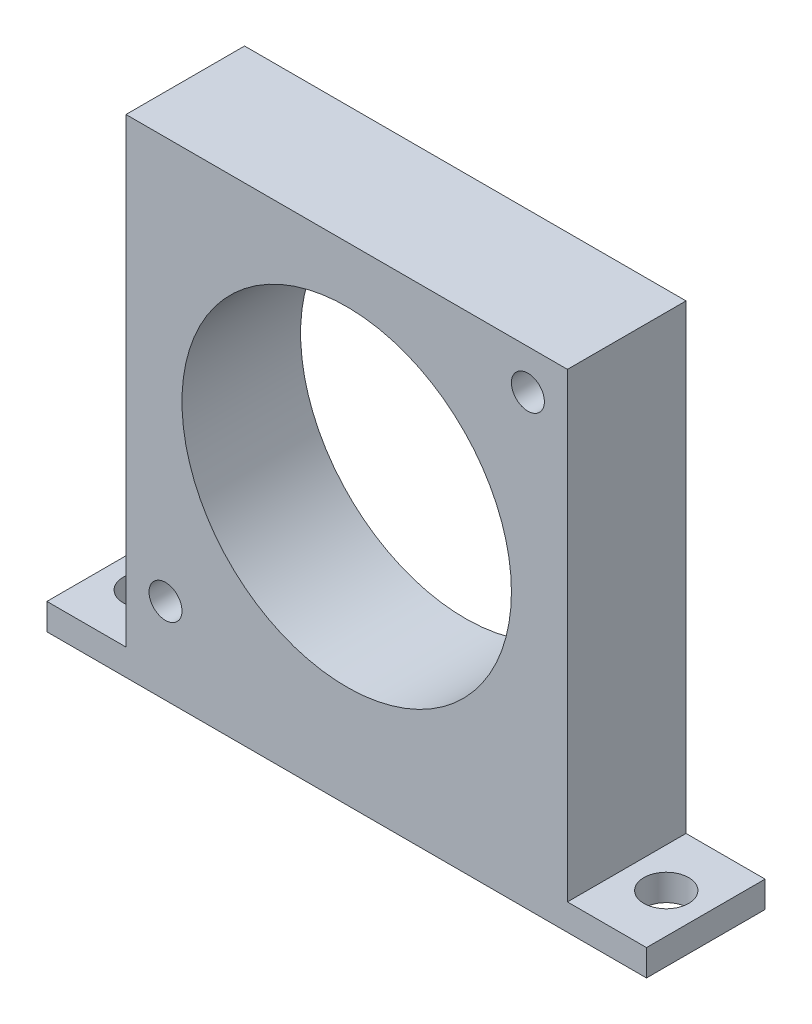
ISO-10303-21;
HEADER;
FILE_DESCRIPTION(('STEP AP214'),'2;1');
FILE_NAME('part.step','',(''),(''),'','','');
FILE_SCHEMA(('AUTOMOTIVE_DESIGN { 1 0 10303 214 1 1 1 1 }'));
ENDSEC;
DATA;
#1=APPLICATION_CONTEXT('core data for automotive mechanical design processes');
#2=APPLICATION_PROTOCOL_DEFINITION('international standard','automotive_design',2000,#1);
#3=PRODUCT_CONTEXT('',#1,'mechanical');
#4=PRODUCT('Part','Part','',(#3));
#5=PRODUCT_RELATED_PRODUCT_CATEGORY('part','',(#4));
#6=PRODUCT_DEFINITION_FORMATION('','',#4);
#7=PRODUCT_DEFINITION_CONTEXT('part definition',#1,'design');
#8=PRODUCT_DEFINITION('design','',#6,#7);
#9=PRODUCT_DEFINITION_SHAPE('','',#8);
#10=(LENGTH_UNIT() NAMED_UNIT(*) SI_UNIT(.MILLI.,.METRE.));
#11=(NAMED_UNIT(*) PLANE_ANGLE_UNIT() SI_UNIT($,.RADIAN.));
#12=(NAMED_UNIT(*) SI_UNIT($,.STERADIAN.) SOLID_ANGLE_UNIT());
#13=UNCERTAINTY_MEASURE_WITH_UNIT(LENGTH_MEASURE(1.E-05),#10,'distance_accuracy_value','');
#14=(GEOMETRIC_REPRESENTATION_CONTEXT(3) GLOBAL_UNCERTAINTY_ASSIGNED_CONTEXT((#13)) GLOBAL_UNIT_ASSIGNED_CONTEXT((#10,
#11,#12)) REPRESENTATION_CONTEXT('',''));
#15=CARTESIAN_POINT('',(0.,0.,0.));
#16=DIRECTION('',(0.,0.,1.));
#17=DIRECTION('',(1.,0.,0.));
#18=AXIS2_PLACEMENT_3D('',#15,#16,#17);
#19=CARTESIAN_POINT('',(0.,2.,9.));
#20=DIRECTION('',(0.,1.,0.));
#21=DIRECTION('',(0.,0.,1.));
#22=AXIS2_PLACEMENT_3D('',#19,#20,#21);
#23=PLANE('',#22);
#24=CARTESIAN_POINT('',(2.99999999999999,2.,4.5));
#25=DIRECTION('',(0.,1.,0.));
#26=DIRECTION('',(0.,0.,1.));
#27=AXIS2_PLACEMENT_3D('',#24,#25,#26);
#28=CIRCLE('',#27,1.7);
#29=CARTESIAN_POINT('',(2.99999999999999,2.,6.2));
#30=VERTEX_POINT('',#29);
#31=EDGE_CURVE('E249',#30,#30,#28,.T.);
#32=ORIENTED_EDGE('',*,*,#31,.F.);
#33=EDGE_LOOP('',(#32));
#34=FACE_BOUND('',#33,.T.);
#35=DIRECTION('',(1.,0.,0.));
#36=VECTOR('',#35,1.);
#37=CARTESIAN_POINT('',(0.,2.,0.));
#38=LINE('',#37,#36);
#39=CARTESIAN_POINT('',(0.,2.,0.));
#40=VERTEX_POINT('',#39);
#41=CARTESIAN_POINT('',(5.99999999999999,2.,0.));
#42=VERTEX_POINT('',#41);
#43=EDGE_CURVE('E141',#40,#42,#38,.T.);
#44=ORIENTED_EDGE('',*,*,#43,.F.);
#45=DIRECTION('',(0.,0.,-1.));
#46=VECTOR('',#45,1.);
#47=CARTESIAN_POINT('',(0.,2.,9.));
#48=LINE('',#47,#46);
#49=CARTESIAN_POINT('',(0.,2.,9.));
#50=VERTEX_POINT('',#49);
#51=EDGE_CURVE('E13',#50,#40,#48,.T.);
#52=ORIENTED_EDGE('',*,*,#51,.F.);
#53=DIRECTION('',(1.,0.,0.));
#54=VECTOR('',#53,1.);
#55=CARTESIAN_POINT('',(0.,2.,9.));
#56=LINE('',#55,#54);
#57=CARTESIAN_POINT('',(5.99999999999999,2.,9.));
#58=VERTEX_POINT('',#57);
#59=EDGE_CURVE('E161',#50,#58,#56,.T.);
#60=ORIENTED_EDGE('',*,*,#59,.T.);
#61=DIRECTION('',(0.,0.,-1.));
#62=VECTOR('',#61,1.);
#63=CARTESIAN_POINT('',(5.99999999999999,2.,9.));
#64=LINE('',#63,#62);
#65=EDGE_CURVE('E47',#58,#42,#64,.T.);
#66=ORIENTED_EDGE('',*,*,#65,.T.);
#67=EDGE_LOOP('',(#44,#52,#60,#66));
#68=FACE_BOUND('',#67,.T.);
#69=ADVANCED_FACE('F44',(#34,#68),#23,.T.);
#70=CARTESIAN_POINT('',(0.,0.,9.));
#71=DIRECTION('',(-1.,0.,0.));
#72=DIRECTION('',(0.,-1.,0.));
#73=AXIS2_PLACEMENT_3D('',#70,#71,#72);
#74=PLANE('',#73);
#75=DIRECTION('',(0.,1.,0.));
#76=VECTOR('',#75,1.);
#77=CARTESIAN_POINT('',(0.,0.,0.));
#78=LINE('',#77,#76);
#79=CARTESIAN_POINT('',(0.,0.,0.));
#80=VERTEX_POINT('',#79);
#81=EDGE_CURVE('E159',#80,#40,#78,.T.);
#82=ORIENTED_EDGE('',*,*,#81,.F.);
#83=DIRECTION('',(0.,0.,-1.));
#84=VECTOR('',#83,1.);
#85=CARTESIAN_POINT('',(0.,0.,9.));
#86=LINE('',#85,#84);
#87=CARTESIAN_POINT('',(0.,0.,9.));
#88=VERTEX_POINT('',#87);
#89=EDGE_CURVE('E53',#88,#80,#86,.T.);
#90=ORIENTED_EDGE('',*,*,#89,.F.);
#91=DIRECTION('',(0.,1.,0.));
#92=VECTOR('',#91,1.);
#93=CARTESIAN_POINT('',(0.,0.,9.));
#94=LINE('',#93,#92);
#95=EDGE_CURVE('E121',#88,#50,#94,.T.);
#96=ORIENTED_EDGE('',*,*,#95,.T.);
#97=ORIENTED_EDGE('',*,*,#51,.T.);
#98=EDGE_LOOP('',(#82,#90,#96,#97));
#99=FACE_BOUND('',#98,.T.);
#100=ADVANCED_FACE('F175',(#99),#74,.T.);
#101=CARTESIAN_POINT('',(0.,0.,9.));
#102=DIRECTION('',(0.,1.,0.));
#103=DIRECTION('',(0.,0.,1.));
#104=AXIS2_PLACEMENT_3D('',#101,#102,#103);
#105=PLANE('',#104);
#106=CARTESIAN_POINT('',(42.5,0.,4.5));
#107=DIRECTION('',(0.,1.,0.));
#108=DIRECTION('',(0.,0.,1.));
#109=AXIS2_PLACEMENT_3D('',#106,#107,#108);
#110=CIRCLE('',#109,1.7);
#111=CARTESIAN_POINT('',(42.5,0.,6.2));
#112=VERTEX_POINT('',#111);
#113=EDGE_CURVE('E246',#112,#112,#110,.T.);
#114=ORIENTED_EDGE('',*,*,#113,.T.);
#115=EDGE_LOOP('',(#114));
#116=FACE_BOUND('',#115,.T.);
#117=CARTESIAN_POINT('',(2.99999999999999,0.,4.5));
#118=DIRECTION('',(0.,1.,0.));
#119=DIRECTION('',(0.,0.,1.));
#120=AXIS2_PLACEMENT_3D('',#117,#118,#119);
#121=CIRCLE('',#120,1.7);
#122=CARTESIAN_POINT('',(2.99999999999999,0.,6.2));
#123=VERTEX_POINT('',#122);
#124=EDGE_CURVE('E252',#123,#123,#121,.T.);
#125=ORIENTED_EDGE('',*,*,#124,.T.);
#126=EDGE_LOOP('',(#125));
#127=FACE_BOUND('',#126,.T.);
#128=DIRECTION('',(1.,0.,0.));
#129=VECTOR('',#128,1.);
#130=CARTESIAN_POINT('',(0.,0.,0.));
#131=LINE('',#130,#129);
#132=CARTESIAN_POINT('',(45.5,0.,0.));
#133=VERTEX_POINT('',#132);
#134=EDGE_CURVE('E126',#80,#133,#131,.T.);
#135=ORIENTED_EDGE('',*,*,#134,.T.);
#136=DIRECTION('',(0.,0.,-1.));
#137=VECTOR('',#136,1.);
#138=CARTESIAN_POINT('',(45.5,0.,9.));
#139=LINE('',#138,#137);
#140=CARTESIAN_POINT('',(45.5,0.,9.));
#141=VERTEX_POINT('',#140);
#142=EDGE_CURVE('E124',#141,#133,#139,.T.);
#143=ORIENTED_EDGE('',*,*,#142,.F.);
#144=DIRECTION('',(1.,0.,0.));
#145=VECTOR('',#144,1.);
#146=CARTESIAN_POINT('',(0.,0.,9.));
#147=LINE('',#146,#145);
#148=EDGE_CURVE('E114',#88,#141,#147,.T.);
#149=ORIENTED_EDGE('',*,*,#148,.F.);
#150=ORIENTED_EDGE('',*,*,#89,.T.);
#151=EDGE_LOOP('',(#135,#143,#149,#150));
#152=FACE_BOUND('',#151,.T.);
#153=ADVANCED_FACE('F125',(#116,#127,#152),#105,.F.);
#154=CARTESIAN_POINT('',(45.5,0.,9.));
#155=DIRECTION('',(-1.,0.,0.));
#156=DIRECTION('',(0.,-1.,0.));
#157=AXIS2_PLACEMENT_3D('',#154,#155,#156);
#158=PLANE('',#157);
#159=DIRECTION('',(0.,1.,0.));
#160=VECTOR('',#159,1.);
#161=CARTESIAN_POINT('',(45.5,0.,0.));
#162=LINE('',#161,#160);
#163=CARTESIAN_POINT('',(45.5,2.,0.));
#164=VERTEX_POINT('',#163);
#165=EDGE_CURVE('E156',#133,#164,#162,.T.);
#166=ORIENTED_EDGE('',*,*,#165,.T.);
#167=DIRECTION('',(0.,0.,-1.));
#168=VECTOR('',#167,1.);
#169=CARTESIAN_POINT('',(45.5,2.,9.));
#170=LINE('',#169,#168);
#171=CARTESIAN_POINT('',(45.5,2.,9.));
#172=VERTEX_POINT('',#171);
#173=EDGE_CURVE('E130',#172,#164,#170,.T.);
#174=ORIENTED_EDGE('',*,*,#173,.F.);
#175=DIRECTION('',(0.,1.,0.));
#176=VECTOR('',#175,1.);
#177=CARTESIAN_POINT('',(45.5,0.,9.));
#178=LINE('',#177,#176);
#179=EDGE_CURVE('E119',#141,#172,#178,.T.);
#180=ORIENTED_EDGE('',*,*,#179,.F.);
#181=ORIENTED_EDGE('',*,*,#142,.T.);
#182=EDGE_LOOP('',(#166,#174,#180,#181));
#183=FACE_BOUND('',#182,.T.);
#184=ADVANCED_FACE('F132',(#183),#158,.F.);
#185=CARTESIAN_POINT('',(39.5,2.,9.));
#186=DIRECTION('',(0.,1.,0.));
#187=DIRECTION('',(0.,0.,1.));
#188=AXIS2_PLACEMENT_3D('',#185,#186,#187);
#189=PLANE('',#188);
#190=CARTESIAN_POINT('',(42.5,2.,4.5));
#191=DIRECTION('',(0.,1.,0.));
#192=DIRECTION('',(0.,0.,1.));
#193=AXIS2_PLACEMENT_3D('',#190,#191,#192);
#194=CIRCLE('',#193,1.7);
#195=CARTESIAN_POINT('',(42.5,2.,6.2));
#196=VERTEX_POINT('',#195);
#197=EDGE_CURVE('E241',#196,#196,#194,.T.);
#198=ORIENTED_EDGE('',*,*,#197,.F.);
#199=EDGE_LOOP('',(#198));
#200=FACE_BOUND('',#199,.T.);
#201=DIRECTION('',(1.,0.,0.));
#202=VECTOR('',#201,1.);
#203=CARTESIAN_POINT('',(39.5,2.,0.));
#204=LINE('',#203,#202);
#205=CARTESIAN_POINT('',(39.5,2.,0.));
#206=VERTEX_POINT('',#205);
#207=EDGE_CURVE('E153',#206,#164,#204,.T.);
#208=ORIENTED_EDGE('',*,*,#207,.F.);
#209=DIRECTION('',(0.,0.,-1.));
#210=VECTOR('',#209,1.);
#211=CARTESIAN_POINT('',(39.5,2.,9.));
#212=LINE('',#211,#210);
#213=CARTESIAN_POINT('',(39.5,2.,9.));
#214=VERTEX_POINT('',#213);
#215=EDGE_CURVE('E165',#214,#206,#212,.T.);
#216=ORIENTED_EDGE('',*,*,#215,.F.);
#217=DIRECTION('',(1.,0.,0.));
#218=VECTOR('',#217,1.);
#219=CARTESIAN_POINT('',(39.5,2.,9.));
#220=LINE('',#219,#218);
#221=EDGE_CURVE('E134',#214,#172,#220,.T.);
#222=ORIENTED_EDGE('',*,*,#221,.T.);
#223=ORIENTED_EDGE('',*,*,#173,.T.);
#224=EDGE_LOOP('',(#208,#216,#222,#223));
#225=FACE_BOUND('',#224,.T.);
#226=ADVANCED_FACE('F190',(#200,#225),#189,.T.);
#227=CARTESIAN_POINT('',(39.5,2.,9.));
#228=DIRECTION('',(-1.,0.,0.));
#229=DIRECTION('',(0.,-1.,0.));
#230=AXIS2_PLACEMENT_3D('',#227,#228,#229);
#231=PLANE('',#230);
#232=DIRECTION('',(0.,1.,0.));
#233=VECTOR('',#232,1.);
#234=CARTESIAN_POINT('',(39.5,2.,0.));
#235=LINE('',#234,#233);
#236=CARTESIAN_POINT('',(39.5,37.,0.));
#237=VERTEX_POINT('',#236);
#238=EDGE_CURVE('E151',#206,#237,#235,.T.);
#239=ORIENTED_EDGE('',*,*,#238,.T.);
#240=DIRECTION('',(0.,0.,-1.));
#241=VECTOR('',#240,1.);
#242=CARTESIAN_POINT('',(39.5,37.,9.));
#243=LINE('',#242,#241);
#244=CARTESIAN_POINT('',(39.5,37.,9.));
#245=VERTEX_POINT('',#244);
#246=EDGE_CURVE('E167',#245,#237,#243,.T.);
#247=ORIENTED_EDGE('',*,*,#246,.F.);
#248=DIRECTION('',(0.,1.,0.));
#249=VECTOR('',#248,1.);
#250=CARTESIAN_POINT('',(39.5,2.,9.));
#251=LINE('',#250,#249);
#252=EDGE_CURVE('E136',#214,#245,#251,.T.);
#253=ORIENTED_EDGE('',*,*,#252,.F.);
#254=ORIENTED_EDGE('',*,*,#215,.T.);
#255=EDGE_LOOP('',(#239,#247,#253,#254));
#256=FACE_BOUND('',#255,.T.);
#257=ADVANCED_FACE('F193',(#256),#231,.F.);
#258=CARTESIAN_POINT('',(39.5,37.,9.));
#259=DIRECTION('',(0.,-1.,0.));
#260=DIRECTION('',(0.,0.,-1.));
#261=AXIS2_PLACEMENT_3D('',#258,#259,#260);
#262=PLANE('',#261);
#263=DIRECTION('',(-1.,0.,0.));
#264=VECTOR('',#263,1.);
#265=CARTESIAN_POINT('',(39.5,37.,0.));
#266=LINE('',#265,#264);
#267=CARTESIAN_POINT('',(6.,37.,0.));
#268=VERTEX_POINT('',#267);
#269=EDGE_CURVE('E148',#237,#268,#266,.T.);
#270=ORIENTED_EDGE('',*,*,#269,.T.);
#271=DIRECTION('',(0.,0.,-1.));
#272=VECTOR('',#271,1.);
#273=CARTESIAN_POINT('',(6.,37.,9.));
#274=LINE('',#273,#272);
#275=CARTESIAN_POINT('',(6.,37.,9.));
#276=VERTEX_POINT('',#275);
#277=EDGE_CURVE('E169',#276,#268,#274,.T.);
#278=ORIENTED_EDGE('',*,*,#277,.F.);
#279=DIRECTION('',(-1.,0.,0.));
#280=VECTOR('',#279,1.);
#281=CARTESIAN_POINT('',(39.5,37.,9.));
#282=LINE('',#281,#280);
#283=EDGE_CURVE('E269',#245,#276,#282,.T.);
#284=ORIENTED_EDGE('',*,*,#283,.F.);
#285=ORIENTED_EDGE('',*,*,#246,.T.);
#286=EDGE_LOOP('',(#270,#278,#284,#285));
#287=FACE_BOUND('',#286,.T.);
#288=ADVANCED_FACE('F197',(#287),#262,.F.);
#289=CARTESIAN_POINT('',(5.99999999999999,2.,9.));
#290=DIRECTION('',(-1.,0.,0.));
#291=DIRECTION('',(0.,-1.,0.));
#292=AXIS2_PLACEMENT_3D('',#289,#290,#291);
#293=PLANE('',#292);
#294=DIRECTION('',(0.,1.,0.));
#295=VECTOR('',#294,1.);
#296=CARTESIAN_POINT('',(5.99999999999999,2.,0.));
#297=LINE('',#296,#295);
#298=EDGE_CURVE('E144',#42,#268,#297,.T.);
#299=ORIENTED_EDGE('',*,*,#298,.F.);
#300=ORIENTED_EDGE('',*,*,#65,.F.);
#301=DIRECTION('',(0.,1.,0.));
#302=VECTOR('',#301,1.);
#303=CARTESIAN_POINT('',(5.99999999999999,2.,9.));
#304=LINE('',#303,#302);
#305=EDGE_CURVE('E267',#58,#276,#304,.T.);
#306=ORIENTED_EDGE('',*,*,#305,.T.);
#307=ORIENTED_EDGE('',*,*,#277,.T.);
#308=EDGE_LOOP('',(#299,#300,#306,#307));
#309=FACE_BOUND('',#308,.T.);
#310=ADVANCED_FACE('F171',(#309),#293,.T.);
#311=CARTESIAN_POINT('',(0.,0.,9.));
#312=DIRECTION('',(0.,0.,1.));
#313=DIRECTION('',(1.,0.,0.));
#314=AXIS2_PLACEMENT_3D('',#311,#312,#313);
#315=PLANE('',#314);
#316=CARTESIAN_POINT('',(22.75,20.25,9.));
#317=DIRECTION('',(0.,0.,1.));
#318=DIRECTION('',(1.,0.,0.));
#319=AXIS2_PLACEMENT_3D('',#316,#317,#318);
#320=CIRCLE('',#319,12.5);
#321=CARTESIAN_POINT('',(35.25,20.25,9.));
#322=VERTEX_POINT('',#321);
#323=EDGE_CURVE('E239',#322,#322,#320,.T.);
#324=ORIENTED_EDGE('',*,*,#323,.F.);
#325=EDGE_LOOP('',(#324));
#326=FACE_BOUND('',#325,.T.);
#327=CARTESIAN_POINT('',(36.5,34.,9.));
#328=DIRECTION('',(0.,0.,1.));
#329=DIRECTION('',(1.,0.,0.));
#330=AXIS2_PLACEMENT_3D('',#327,#328,#329);
#331=CIRCLE('',#330,1.24999999999999);
#332=CARTESIAN_POINT('',(37.75,34.,9.));
#333=VERTEX_POINT('',#332);
#334=EDGE_CURVE('E255',#333,#333,#331,.T.);
#335=ORIENTED_EDGE('',*,*,#334,.F.);
#336=EDGE_LOOP('',(#335));
#337=FACE_BOUND('',#336,.T.);
#338=CARTESIAN_POINT('',(8.99999999999999,6.5,9.));
#339=DIRECTION('',(0.,0.,1.));
#340=DIRECTION('',(1.,0.,0.));
#341=AXIS2_PLACEMENT_3D('',#338,#339,#340);
#342=CIRCLE('',#341,1.24999999999999);
#343=CARTESIAN_POINT('',(10.25,6.5,9.));
#344=VERTEX_POINT('',#343);
#345=EDGE_CURVE('E261',#344,#344,#342,.T.);
#346=ORIENTED_EDGE('',*,*,#345,.F.);
#347=EDGE_LOOP('',(#346));
#348=FACE_BOUND('',#347,.T.);
#349=ORIENTED_EDGE('',*,*,#59,.F.);
#350=ORIENTED_EDGE('',*,*,#95,.F.);
#351=ORIENTED_EDGE('',*,*,#148,.T.);
#352=ORIENTED_EDGE('',*,*,#179,.T.);
#353=ORIENTED_EDGE('',*,*,#221,.F.);
#354=ORIENTED_EDGE('',*,*,#252,.T.);
#355=ORIENTED_EDGE('',*,*,#283,.T.);
#356=ORIENTED_EDGE('',*,*,#305,.F.);
#357=EDGE_LOOP('',(#349,#350,#351,#352,#353,#354,#355,#356));
#358=FACE_BOUND('',#357,.T.);
#359=ADVANCED_FACE('F116',(#326,#337,#348,#358),#315,.T.);
#360=CARTESIAN_POINT('',(0.,0.,0.));
#361=DIRECTION('',(0.,0.,1.));
#362=DIRECTION('',(1.,0.,0.));
#363=AXIS2_PLACEMENT_3D('',#360,#361,#362);
#364=PLANE('',#363);
#365=CARTESIAN_POINT('',(22.75,20.25,0.));
#366=DIRECTION('',(0.,0.,1.));
#367=DIRECTION('',(1.,0.,0.));
#368=AXIS2_PLACEMENT_3D('',#365,#366,#367);
#369=CIRCLE('',#368,12.5);
#370=CARTESIAN_POINT('',(35.25,20.25,0.));
#371=VERTEX_POINT('',#370);
#372=EDGE_CURVE('E237',#371,#371,#369,.T.);
#373=ORIENTED_EDGE('',*,*,#372,.T.);
#374=EDGE_LOOP('',(#373));
#375=FACE_BOUND('',#374,.T.);
#376=CARTESIAN_POINT('',(36.5,34.,0.));
#377=DIRECTION('',(0.,0.,1.));
#378=DIRECTION('',(1.,0.,0.));
#379=AXIS2_PLACEMENT_3D('',#376,#377,#378);
#380=CIRCLE('',#379,1.25);
#381=CARTESIAN_POINT('',(37.75,34.,0.));
#382=VERTEX_POINT('',#381);
#383=EDGE_CURVE('E258',#382,#382,#380,.T.);
#384=ORIENTED_EDGE('',*,*,#383,.T.);
#385=EDGE_LOOP('',(#384));
#386=FACE_BOUND('',#385,.T.);
#387=CARTESIAN_POINT('',(8.99999999999999,6.5,0.));
#388=DIRECTION('',(0.,0.,1.));
#389=DIRECTION('',(1.,0.,0.));
#390=AXIS2_PLACEMENT_3D('',#387,#388,#389);
#391=CIRCLE('',#390,1.25);
#392=CARTESIAN_POINT('',(10.25,6.5,0.));
#393=VERTEX_POINT('',#392);
#394=EDGE_CURVE('E145',#393,#393,#391,.T.);
#395=ORIENTED_EDGE('',*,*,#394,.T.);
#396=EDGE_LOOP('',(#395));
#397=FACE_BOUND('',#396,.T.);
#398=ORIENTED_EDGE('',*,*,#43,.T.);
#399=ORIENTED_EDGE('',*,*,#298,.T.);
#400=ORIENTED_EDGE('',*,*,#269,.F.);
#401=ORIENTED_EDGE('',*,*,#238,.F.);
#402=ORIENTED_EDGE('',*,*,#207,.T.);
#403=ORIENTED_EDGE('',*,*,#165,.F.);
#404=ORIENTED_EDGE('',*,*,#134,.F.);
#405=ORIENTED_EDGE('',*,*,#81,.T.);
#406=EDGE_LOOP('',(#398,#399,#400,#401,#402,#403,#404,#405));
#407=FACE_BOUND('',#406,.T.);
#408=ADVANCED_FACE('F174',(#375,#386,#397,#407),#364,.F.);
#409=CARTESIAN_POINT('',(8.99999999999999,6.5,9.));
#410=DIRECTION('',(0.,0.,1.));
#411=DIRECTION('',(1.,0.,0.));
#412=AXIS2_PLACEMENT_3D('',#409,#410,#411);
#413=CYLINDRICAL_SURFACE('',#412,1.24999999999999);
#414=ORIENTED_EDGE('',*,*,#394,.F.);
#415=EDGE_LOOP('',(#414));
#416=FACE_BOUND('',#415,.T.);
#417=ORIENTED_EDGE('',*,*,#345,.T.);
#418=EDGE_LOOP('',(#417));
#419=FACE_BOUND('',#418,.T.);
#420=ADVANCED_FACE('F209',(#416,#419),#413,.F.);
#421=CARTESIAN_POINT('',(36.5,34.,9.));
#422=DIRECTION('',(0.,0.,1.));
#423=DIRECTION('',(1.,0.,0.));
#424=AXIS2_PLACEMENT_3D('',#421,#422,#423);
#425=CYLINDRICAL_SURFACE('',#424,1.24999999999999);
#426=ORIENTED_EDGE('',*,*,#383,.F.);
#427=EDGE_LOOP('',(#426));
#428=FACE_BOUND('',#427,.T.);
#429=ORIENTED_EDGE('',*,*,#334,.T.);
#430=EDGE_LOOP('',(#429));
#431=FACE_BOUND('',#430,.T.);
#432=ADVANCED_FACE('F216',(#428,#431),#425,.F.);
#433=CARTESIAN_POINT('',(2.99999999999999,2.,4.5));
#434=DIRECTION('',(0.,1.,0.));
#435=DIRECTION('',(0.,0.,1.));
#436=AXIS2_PLACEMENT_3D('',#433,#434,#435);
#437=CYLINDRICAL_SURFACE('',#436,1.7);
#438=ORIENTED_EDGE('',*,*,#124,.F.);
#439=EDGE_LOOP('',(#438));
#440=FACE_BOUND('',#439,.T.);
#441=ORIENTED_EDGE('',*,*,#31,.T.);
#442=EDGE_LOOP('',(#441));
#443=FACE_BOUND('',#442,.T.);
#444=ADVANCED_FACE('F220',(#440,#443),#437,.F.);
#445=CARTESIAN_POINT('',(42.5,2.,4.5));
#446=DIRECTION('',(0.,1.,0.));
#447=DIRECTION('',(0.,0.,1.));
#448=AXIS2_PLACEMENT_3D('',#445,#446,#447);
#449=CYLINDRICAL_SURFACE('',#448,1.7);
#450=ORIENTED_EDGE('',*,*,#113,.F.);
#451=EDGE_LOOP('',(#450));
#452=FACE_BOUND('',#451,.T.);
#453=ORIENTED_EDGE('',*,*,#197,.T.);
#454=EDGE_LOOP('',(#453));
#455=FACE_BOUND('',#454,.T.);
#456=ADVANCED_FACE('F224',(#452,#455),#449,.F.);
#457=CARTESIAN_POINT('',(22.75,20.25,9.));
#458=DIRECTION('',(0.,0.,1.));
#459=DIRECTION('',(1.,0.,0.));
#460=AXIS2_PLACEMENT_3D('',#457,#458,#459);
#461=CYLINDRICAL_SURFACE('',#460,12.5);
#462=ORIENTED_EDGE('',*,*,#372,.F.);
#463=EDGE_LOOP('',(#462));
#464=FACE_BOUND('',#463,.T.);
#465=ORIENTED_EDGE('',*,*,#323,.T.);
#466=EDGE_LOOP('',(#465));
#467=FACE_BOUND('',#466,.T.);
#468=ADVANCED_FACE('F228',(#464,#467),#461,.F.);
#469=CLOSED_SHELL('',(#69,#100,#153,#184,#226,#257,#288,#310,#359,#408,#420,#432,#444,#456,#468));
#470=MANIFOLD_SOLID_BREP('B2',#469);
#471=ADVANCED_BREP_SHAPE_REPRESENTATION('',(#18,#470),#14);
#472=SHAPE_DEFINITION_REPRESENTATION(#9,#471);
ENDSEC;
END-ISO-10303-21;
